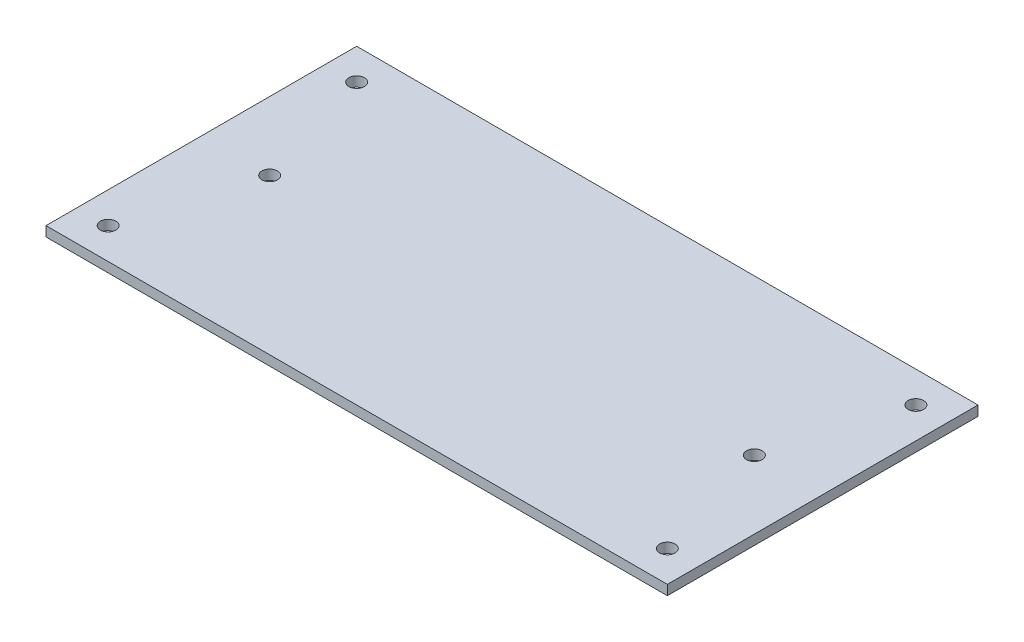
ISO-10303-21;
HEADER;
FILE_DESCRIPTION(('STEP AP214'),'2;1');
FILE_NAME('part.step','',(''),(''),'','','');
FILE_SCHEMA(('AUTOMOTIVE_DESIGN { 1 0 10303 214 1 1 1 1 }'));
ENDSEC;
DATA;
#1=APPLICATION_CONTEXT('core data for automotive mechanical design processes');
#2=APPLICATION_PROTOCOL_DEFINITION('international standard','automotive_design',2000,#1);
#3=PRODUCT_CONTEXT('',#1,'mechanical');
#4=PRODUCT('Part','Part','',(#3));
#5=PRODUCT_RELATED_PRODUCT_CATEGORY('part','',(#4));
#6=PRODUCT_DEFINITION_FORMATION('','',#4);
#7=PRODUCT_DEFINITION_CONTEXT('part definition',#1,'design');
#8=PRODUCT_DEFINITION('design','',#6,#7);
#9=PRODUCT_DEFINITION_SHAPE('','',#8);
#10=(LENGTH_UNIT() NAMED_UNIT(*) SI_UNIT(.MILLI.,.METRE.));
#11=(NAMED_UNIT(*) PLANE_ANGLE_UNIT() SI_UNIT($,.RADIAN.));
#12=(NAMED_UNIT(*) SI_UNIT($,.STERADIAN.) SOLID_ANGLE_UNIT());
#13=UNCERTAINTY_MEASURE_WITH_UNIT(LENGTH_MEASURE(1.E-05),#10,'distance_accuracy_value','');
#14=(GEOMETRIC_REPRESENTATION_CONTEXT(3) GLOBAL_UNCERTAINTY_ASSIGNED_CONTEXT((#13)) GLOBAL_UNIT_ASSIGNED_CONTEXT((#10,
#11,#12)) REPRESENTATION_CONTEXT('',''));
#15=CARTESIAN_POINT('',(0.,0.,0.));
#16=DIRECTION('',(0.,0.,1.));
#17=DIRECTION('',(1.,0.,0.));
#18=AXIS2_PLACEMENT_3D('',#15,#16,#17);
#19=CARTESIAN_POINT('',(0.,3.175,50.));
#20=DIRECTION('',(0.,0.,-1.));
#21=DIRECTION('',(-1.,0.,0.));
#22=AXIS2_PLACEMENT_3D('',#19,#20,#21);
#23=PLANE('',#22);
#24=DIRECTION('',(1.,0.,0.));
#25=VECTOR('',#24,1.);
#26=CARTESIAN_POINT('',(0.,0.,50.));
#27=LINE('',#26,#25);
#28=CARTESIAN_POINT('',(-100.,0.,50.));
#29=VERTEX_POINT('',#28);
#30=CARTESIAN_POINT('',(100.,0.,50.));
#31=VERTEX_POINT('',#30);
#32=EDGE_CURVE('E131',#29,#31,#27,.T.);
#33=ORIENTED_EDGE('',*,*,#32,.T.);
#34=DIRECTION('',(0.,-1.,0.));
#35=VECTOR('',#34,1.);
#36=CARTESIAN_POINT('',(100.,3.175,50.));
#37=LINE('',#36,#35);
#38=CARTESIAN_POINT('',(100.,3.175,50.));
#39=VERTEX_POINT('',#38);
#40=EDGE_CURVE('E11',#39,#31,#37,.T.);
#41=ORIENTED_EDGE('',*,*,#40,.F.);
#42=DIRECTION('',(1.,0.,0.));
#43=VECTOR('',#42,1.);
#44=CARTESIAN_POINT('',(0.,3.175,50.));
#45=LINE('',#44,#43);
#46=CARTESIAN_POINT('',(-100.,3.175,50.));
#47=VERTEX_POINT('',#46);
#48=EDGE_CURVE('E97',#47,#39,#45,.T.);
#49=ORIENTED_EDGE('',*,*,#48,.F.);
#50=DIRECTION('',(0.,-1.,0.));
#51=VECTOR('',#50,1.);
#52=CARTESIAN_POINT('',(-100.,3.175,50.));
#53=LINE('',#52,#51);
#54=EDGE_CURVE('E63',#47,#29,#53,.T.);
#55=ORIENTED_EDGE('',*,*,#54,.T.);
#56=EDGE_LOOP('',(#33,#41,#49,#55));
#57=FACE_BOUND('',#56,.T.);
#58=ADVANCED_FACE('F50',(#57),#23,.F.);
#59=CARTESIAN_POINT('',(100.,3.175,0.));
#60=DIRECTION('',(-1.,0.,0.));
#61=DIRECTION('',(0.,0.,1.));
#62=AXIS2_PLACEMENT_3D('',#59,#60,#61);
#63=PLANE('',#62);
#64=DIRECTION('',(0.,0.,-1.));
#65=VECTOR('',#64,1.);
#66=CARTESIAN_POINT('',(100.,0.,0.));
#67=LINE('',#66,#65);
#68=CARTESIAN_POINT('',(100.,0.,-50.));
#69=VERTEX_POINT('',#68);
#70=EDGE_CURVE('E104',#31,#69,#67,.T.);
#71=ORIENTED_EDGE('',*,*,#70,.T.);
#72=DIRECTION('',(0.,-1.,0.));
#73=VECTOR('',#72,1.);
#74=CARTESIAN_POINT('',(100.,3.175,-50.));
#75=LINE('',#74,#73);
#76=CARTESIAN_POINT('',(100.,3.175,-50.));
#77=VERTEX_POINT('',#76);
#78=EDGE_CURVE('E60',#77,#69,#75,.T.);
#79=ORIENTED_EDGE('',*,*,#78,.F.);
#80=DIRECTION('',(0.,0.,-1.));
#81=VECTOR('',#80,1.);
#82=CARTESIAN_POINT('',(100.,3.175,0.));
#83=LINE('',#82,#81);
#84=EDGE_CURVE('E89',#39,#77,#83,.T.);
#85=ORIENTED_EDGE('',*,*,#84,.F.);
#86=ORIENTED_EDGE('',*,*,#40,.T.);
#87=EDGE_LOOP('',(#71,#79,#85,#86));
#88=FACE_BOUND('',#87,.T.);
#89=ADVANCED_FACE('F102',(#88),#63,.F.);
#90=CARTESIAN_POINT('',(0.,3.175,-50.));
#91=DIRECTION('',(0.,0.,-1.));
#92=DIRECTION('',(-1.,0.,0.));
#93=AXIS2_PLACEMENT_3D('',#90,#91,#92);
#94=PLANE('',#93);
#95=DIRECTION('',(1.,0.,0.));
#96=VECTOR('',#95,1.);
#97=CARTESIAN_POINT('',(0.,0.,-50.));
#98=LINE('',#97,#96);
#99=CARTESIAN_POINT('',(-100.,0.,-50.));
#100=VERTEX_POINT('',#99);
#101=EDGE_CURVE('E139',#100,#69,#98,.T.);
#102=ORIENTED_EDGE('',*,*,#101,.F.);
#103=DIRECTION('',(0.,-1.,0.));
#104=VECTOR('',#103,1.);
#105=CARTESIAN_POINT('',(-100.,3.175,-50.));
#106=LINE('',#105,#104);
#107=CARTESIAN_POINT('',(-100.,3.175,-50.));
#108=VERTEX_POINT('',#107);
#109=EDGE_CURVE('E76',#108,#100,#106,.T.);
#110=ORIENTED_EDGE('',*,*,#109,.F.);
#111=DIRECTION('',(1.,0.,0.));
#112=VECTOR('',#111,1.);
#113=CARTESIAN_POINT('',(0.,3.175,-50.));
#114=LINE('',#113,#112);
#115=EDGE_CURVE('E98',#108,#77,#114,.T.);
#116=ORIENTED_EDGE('',*,*,#115,.T.);
#117=ORIENTED_EDGE('',*,*,#78,.T.);
#118=EDGE_LOOP('',(#102,#110,#116,#117));
#119=FACE_BOUND('',#118,.T.);
#120=ADVANCED_FACE('F108',(#119),#94,.T.);
#121=CARTESIAN_POINT('',(-100.,3.175,0.));
#122=DIRECTION('',(-1.,0.,0.));
#123=DIRECTION('',(0.,0.,1.));
#124=AXIS2_PLACEMENT_3D('',#121,#122,#123);
#125=PLANE('',#124);
#126=DIRECTION('',(0.,0.,-1.));
#127=VECTOR('',#126,1.);
#128=CARTESIAN_POINT('',(-100.,0.,0.));
#129=LINE('',#128,#127);
#130=EDGE_CURVE('E142',#29,#100,#129,.T.);
#131=ORIENTED_EDGE('',*,*,#130,.F.);
#132=ORIENTED_EDGE('',*,*,#54,.F.);
#133=DIRECTION('',(0.,0.,-1.));
#134=VECTOR('',#133,1.);
#135=CARTESIAN_POINT('',(-100.,3.175,0.));
#136=LINE('',#135,#134);
#137=EDGE_CURVE('E112',#47,#108,#136,.T.);
#138=ORIENTED_EDGE('',*,*,#137,.T.);
#139=ORIENTED_EDGE('',*,*,#109,.T.);
#140=EDGE_LOOP('',(#131,#132,#138,#139));
#141=FACE_BOUND('',#140,.T.);
#142=ADVANCED_FACE('F202',(#141),#125,.T.);
#143=CARTESIAN_POINT('',(-90.,3.175,-40.));
#144=DIRECTION('',(0.,-1.,0.));
#145=DIRECTION('',(0.,0.,-1.));
#146=AXIS2_PLACEMENT_3D('',#143,#144,#145);
#147=CYLINDRICAL_SURFACE('',#146,2.5);
#148=CARTESIAN_POINT('',(-90.,3.175,-40.));
#149=DIRECTION('',(0.,1.,0.));
#150=DIRECTION('',(0.,0.,1.));
#151=AXIS2_PLACEMENT_3D('',#148,#149,#150);
#152=CIRCLE('',#151,2.5);
#153=CARTESIAN_POINT('',(-90.,3.175,-37.5));
#154=VERTEX_POINT('',#153);
#155=EDGE_CURVE('E163',#154,#154,#152,.T.);
#156=ORIENTED_EDGE('',*,*,#155,.T.);
#157=EDGE_LOOP('',(#156));
#158=FACE_BOUND('',#157,.T.);
#159=CARTESIAN_POINT('',(-90.,0.,-40.));
#160=DIRECTION('',(0.,1.,0.));
#161=DIRECTION('',(0.,0.,1.));
#162=AXIS2_PLACEMENT_3D('',#159,#160,#161);
#163=CIRCLE('',#162,2.5);
#164=CARTESIAN_POINT('',(-90.,0.,-37.5));
#165=VERTEX_POINT('',#164);
#166=EDGE_CURVE('E128',#165,#165,#163,.T.);
#167=ORIENTED_EDGE('',*,*,#166,.F.);
#168=EDGE_LOOP('',(#167));
#169=FACE_BOUND('',#168,.T.);
#170=ADVANCED_FACE('F173',(#158,#169),#147,.F.);
#171=CARTESIAN_POINT('',(-90.,3.175,40.));
#172=DIRECTION('',(0.,-1.,0.));
#173=DIRECTION('',(0.,0.,-1.));
#174=AXIS2_PLACEMENT_3D('',#171,#172,#173);
#175=CYLINDRICAL_SURFACE('',#174,2.5);
#176=CARTESIAN_POINT('',(-90.,3.175,40.));
#177=DIRECTION('',(0.,1.,0.));
#178=DIRECTION('',(0.,0.,1.));
#179=AXIS2_PLACEMENT_3D('',#176,#177,#178);
#180=CIRCLE('',#179,2.5);
#181=CARTESIAN_POINT('',(-90.,3.175,42.5));
#182=VERTEX_POINT('',#181);
#183=EDGE_CURVE('E158',#182,#182,#180,.F.);
#184=ORIENTED_EDGE('',*,*,#183,.F.);
#185=EDGE_LOOP('',(#184));
#186=FACE_BOUND('',#185,.T.);
#187=CARTESIAN_POINT('',(-90.,0.,40.));
#188=DIRECTION('',(0.,1.,0.));
#189=DIRECTION('',(0.,0.,1.));
#190=AXIS2_PLACEMENT_3D('',#187,#188,#189);
#191=CIRCLE('',#190,2.5);
#192=CARTESIAN_POINT('',(-90.,0.,42.5));
#193=VERTEX_POINT('',#192);
#194=EDGE_CURVE('E121',#193,#193,#191,.F.);
#195=ORIENTED_EDGE('',*,*,#194,.T.);
#196=EDGE_LOOP('',(#195));
#197=FACE_BOUND('',#196,.T.);
#198=ADVANCED_FACE('F204',(#186,#197),#175,.F.);
#199=CARTESIAN_POINT('',(90.,3.175,40.));
#200=DIRECTION('',(0.,-1.,0.));
#201=DIRECTION('',(0.,0.,-1.));
#202=AXIS2_PLACEMENT_3D('',#199,#200,#201);
#203=CYLINDRICAL_SURFACE('',#202,2.5);
#204=CARTESIAN_POINT('',(90.,3.175,40.));
#205=DIRECTION('',(0.,1.,0.));
#206=DIRECTION('',(0.,0.,1.));
#207=AXIS2_PLACEMENT_3D('',#204,#205,#206);
#208=CIRCLE('',#207,2.5);
#209=CARTESIAN_POINT('',(90.,3.175,42.5));
#210=VERTEX_POINT('',#209);
#211=EDGE_CURVE('E147',#210,#210,#208,.T.);
#212=ORIENTED_EDGE('',*,*,#211,.T.);
#213=EDGE_LOOP('',(#212));
#214=FACE_BOUND('',#213,.T.);
#215=CARTESIAN_POINT('',(90.,0.,40.));
#216=DIRECTION('',(0.,1.,0.));
#217=DIRECTION('',(0.,0.,1.));
#218=AXIS2_PLACEMENT_3D('',#215,#216,#217);
#219=CIRCLE('',#218,2.5);
#220=CARTESIAN_POINT('',(90.,0.,42.5));
#221=VERTEX_POINT('',#220);
#222=EDGE_CURVE('E122',#221,#221,#219,.T.);
#223=ORIENTED_EDGE('',*,*,#222,.F.);
#224=EDGE_LOOP('',(#223));
#225=FACE_BOUND('',#224,.T.);
#226=ADVANCED_FACE('F47',(#214,#225),#203,.F.);
#227=CARTESIAN_POINT('',(90.,3.175,-40.));
#228=DIRECTION('',(0.,-1.,0.));
#229=DIRECTION('',(0.,0.,-1.));
#230=AXIS2_PLACEMENT_3D('',#227,#228,#229);
#231=CYLINDRICAL_SURFACE('',#230,2.5);
#232=CARTESIAN_POINT('',(90.,3.175,-40.));
#233=DIRECTION('',(0.,1.,0.));
#234=DIRECTION('',(0.,0.,1.));
#235=AXIS2_PLACEMENT_3D('',#232,#233,#234);
#236=CIRCLE('',#235,2.5);
#237=CARTESIAN_POINT('',(90.,3.175,-37.5));
#238=VERTEX_POINT('',#237);
#239=EDGE_CURVE('E111',#238,#238,#236,.F.);
#240=ORIENTED_EDGE('',*,*,#239,.F.);
#241=EDGE_LOOP('',(#240));
#242=FACE_BOUND('',#241,.T.);
#243=CARTESIAN_POINT('',(90.,0.,-40.));
#244=DIRECTION('',(0.,1.,0.));
#245=DIRECTION('',(0.,0.,1.));
#246=AXIS2_PLACEMENT_3D('',#243,#244,#245);
#247=CIRCLE('',#246,2.5);
#248=CARTESIAN_POINT('',(90.,0.,-37.5));
#249=VERTEX_POINT('',#248);
#250=EDGE_CURVE('E148',#249,#249,#247,.F.);
#251=ORIENTED_EDGE('',*,*,#250,.T.);
#252=EDGE_LOOP('',(#251));
#253=FACE_BOUND('',#252,.T.);
#254=ADVANCED_FACE('F176',(#242,#253),#231,.F.);
#255=CARTESIAN_POINT('',(0.,3.175,0.));
#256=DIRECTION('',(0.,1.,0.));
#257=DIRECTION('',(0.,0.,1.));
#258=AXIS2_PLACEMENT_3D('',#255,#256,#257);
#259=PLANE('',#258);
#260=CARTESIAN_POINT('',(-78.,3.175,0.));
#261=DIRECTION('',(0.,1.,0.));
#262=DIRECTION('',(0.,0.,1.));
#263=AXIS2_PLACEMENT_3D('',#260,#261,#262);
#264=CIRCLE('',#263,2.49999999999999);
#265=CARTESIAN_POINT('',(-78.,3.175,2.49999999999999));
#266=VERTEX_POINT('',#265);
#267=EDGE_CURVE('E293',#266,#266,#264,.T.);
#268=ORIENTED_EDGE('',*,*,#267,.F.);
#269=EDGE_LOOP('',(#268));
#270=FACE_BOUND('',#269,.T.);
#271=CARTESIAN_POINT('',(78.,3.175,0.));
#272=DIRECTION('',(0.,1.,0.));
#273=DIRECTION('',(0.,0.,-1.));
#274=AXIS2_PLACEMENT_3D('',#271,#272,#273);
#275=CIRCLE('',#274,2.49999999999999);
#276=CARTESIAN_POINT('',(78.,3.175,-2.49999999999999));
#277=VERTEX_POINT('',#276);
#278=EDGE_CURVE('E300',#277,#277,#275,.T.);
#279=ORIENTED_EDGE('',*,*,#278,.F.);
#280=EDGE_LOOP('',(#279));
#281=FACE_BOUND('',#280,.T.);
#282=ORIENTED_EDGE('',*,*,#211,.F.);
#283=EDGE_LOOP('',(#282));
#284=FACE_BOUND('',#283,.T.);
#285=ORIENTED_EDGE('',*,*,#183,.T.);
#286=EDGE_LOOP('',(#285));
#287=FACE_BOUND('',#286,.T.);
#288=ORIENTED_EDGE('',*,*,#155,.F.);
#289=EDGE_LOOP('',(#288));
#290=FACE_BOUND('',#289,.T.);
#291=ORIENTED_EDGE('',*,*,#48,.T.);
#292=ORIENTED_EDGE('',*,*,#84,.T.);
#293=ORIENTED_EDGE('',*,*,#115,.F.);
#294=ORIENTED_EDGE('',*,*,#137,.F.);
#295=EDGE_LOOP('',(#291,#292,#293,#294));
#296=FACE_BOUND('',#295,.T.);
#297=ORIENTED_EDGE('',*,*,#239,.T.);
#298=EDGE_LOOP('',(#297));
#299=FACE_BOUND('',#298,.T.);
#300=ADVANCED_FACE('F94',(#270,#281,#284,#287,#290,#296,#299),#259,.T.);
#301=CARTESIAN_POINT('',(0.,0.,0.));
#302=DIRECTION('',(0.,1.,0.));
#303=DIRECTION('',(0.,0.,1.));
#304=AXIS2_PLACEMENT_3D('',#301,#302,#303);
#305=PLANE('',#304);
#306=CARTESIAN_POINT('',(-78.,0.,0.));
#307=DIRECTION('',(0.,1.,0.));
#308=DIRECTION('',(0.,0.,1.));
#309=AXIS2_PLACEMENT_3D('',#306,#307,#308);
#310=CIRCLE('',#309,2.49999999999999);
#311=CARTESIAN_POINT('',(-78.,0.,2.49999999999999));
#312=VERTEX_POINT('',#311);
#313=EDGE_CURVE('E127',#312,#312,#310,.T.);
#314=ORIENTED_EDGE('',*,*,#313,.T.);
#315=EDGE_LOOP('',(#314));
#316=FACE_BOUND('',#315,.T.);
#317=CARTESIAN_POINT('',(78.,0.,0.));
#318=DIRECTION('',(0.,1.,0.));
#319=DIRECTION('',(0.,0.,-1.));
#320=AXIS2_PLACEMENT_3D('',#317,#318,#319);
#321=CIRCLE('',#320,2.49999999999999);
#322=CARTESIAN_POINT('',(78.,0.,-2.49999999999999));
#323=VERTEX_POINT('',#322);
#324=EDGE_CURVE('E170',#323,#323,#321,.T.);
#325=ORIENTED_EDGE('',*,*,#324,.T.);
#326=EDGE_LOOP('',(#325));
#327=FACE_BOUND('',#326,.T.);
#328=ORIENTED_EDGE('',*,*,#222,.T.);
#329=EDGE_LOOP('',(#328));
#330=FACE_BOUND('',#329,.T.);
#331=ORIENTED_EDGE('',*,*,#194,.F.);
#332=EDGE_LOOP('',(#331));
#333=FACE_BOUND('',#332,.T.);
#334=ORIENTED_EDGE('',*,*,#166,.T.);
#335=EDGE_LOOP('',(#334));
#336=FACE_BOUND('',#335,.T.);
#337=ORIENTED_EDGE('',*,*,#32,.F.);
#338=ORIENTED_EDGE('',*,*,#130,.T.);
#339=ORIENTED_EDGE('',*,*,#101,.T.);
#340=ORIENTED_EDGE('',*,*,#70,.F.);
#341=EDGE_LOOP('',(#337,#338,#339,#340));
#342=FACE_BOUND('',#341,.T.);
#343=ORIENTED_EDGE('',*,*,#250,.F.);
#344=EDGE_LOOP('',(#343));
#345=FACE_BOUND('',#344,.T.);
#346=ADVANCED_FACE('F179',(#316,#327,#330,#333,#336,#342,#345),#305,.F.);
#347=CARTESIAN_POINT('',(78.,0.,0.));
#348=DIRECTION('',(0.,1.,0.));
#349=DIRECTION('',(0.,0.,1.));
#350=AXIS2_PLACEMENT_3D('',#347,#348,#349);
#351=CYLINDRICAL_SURFACE('',#350,2.49999999999999);
#352=ORIENTED_EDGE('',*,*,#324,.F.);
#353=EDGE_LOOP('',(#352));
#354=FACE_BOUND('',#353,.T.);
#355=ORIENTED_EDGE('',*,*,#278,.T.);
#356=EDGE_LOOP('',(#355));
#357=FACE_BOUND('',#356,.T.);
#358=ADVANCED_FACE('F190',(#354,#357),#351,.F.);
#359=CARTESIAN_POINT('',(-78.,0.,0.));
#360=DIRECTION('',(0.,1.,0.));
#361=DIRECTION('',(0.,0.,1.));
#362=AXIS2_PLACEMENT_3D('',#359,#360,#361);
#363=CYLINDRICAL_SURFACE('',#362,2.49999999999999);
#364=ORIENTED_EDGE('',*,*,#313,.F.);
#365=EDGE_LOOP('',(#364));
#366=FACE_BOUND('',#365,.T.);
#367=ORIENTED_EDGE('',*,*,#267,.T.);
#368=EDGE_LOOP('',(#367));
#369=FACE_BOUND('',#368,.T.);
#370=ADVANCED_FACE('F280',(#366,#369),#363,.F.);
#371=CLOSED_SHELL('',(#58,#89,#120,#142,#170,#198,#226,#254,#300,#346,#358,#370));
#372=MANIFOLD_SOLID_BREP('B2',#371);
#373=ADVANCED_BREP_SHAPE_REPRESENTATION('',(#18,#372),#14);
#374=SHAPE_DEFINITION_REPRESENTATION(#9,#373);
ENDSEC;
END-ISO-10303-21;
